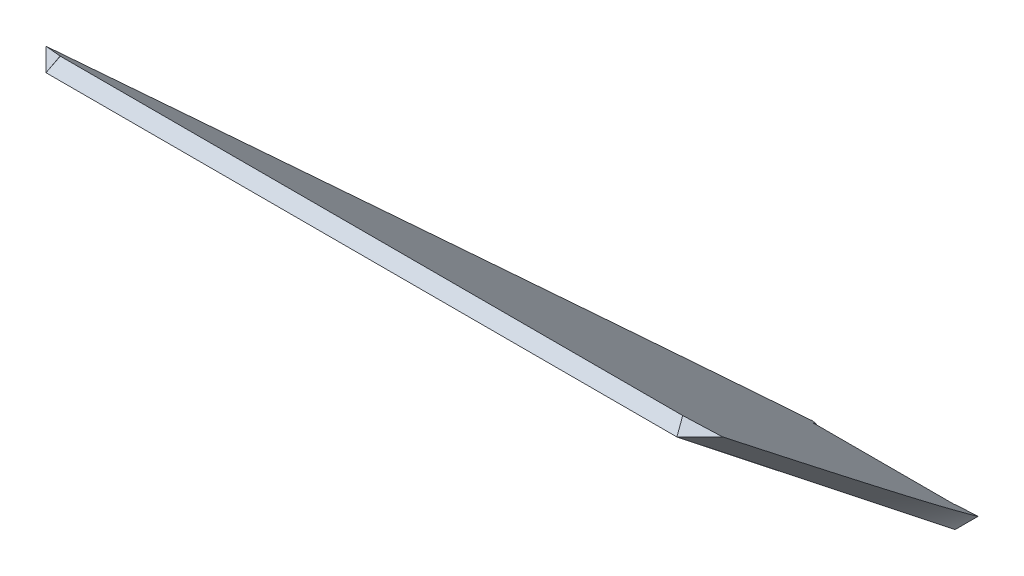
ISO-10303-21;
HEADER;
FILE_DESCRIPTION(('STEP AP214'),'2;1');
FILE_NAME('part.step','',(''),(''),'','','');
FILE_SCHEMA(('AUTOMOTIVE_DESIGN { 1 0 10303 214 1 1 1 1 }'));
ENDSEC;
DATA;
#1=APPLICATION_CONTEXT('core data for automotive mechanical design processes');
#2=APPLICATION_PROTOCOL_DEFINITION('international standard','automotive_design',2000,#1);
#3=PRODUCT_CONTEXT('',#1,'mechanical');
#4=PRODUCT('Part','Part','',(#3));
#5=PRODUCT_RELATED_PRODUCT_CATEGORY('part','',(#4));
#6=PRODUCT_DEFINITION_FORMATION('','',#4);
#7=PRODUCT_DEFINITION_CONTEXT('part definition',#1,'design');
#8=PRODUCT_DEFINITION('design','',#6,#7);
#9=PRODUCT_DEFINITION_SHAPE('','',#8);
#10=(LENGTH_UNIT() NAMED_UNIT(*) SI_UNIT(.MILLI.,.METRE.));
#11=(NAMED_UNIT(*) PLANE_ANGLE_UNIT() SI_UNIT($,.RADIAN.));
#12=(NAMED_UNIT(*) SI_UNIT($,.STERADIAN.) SOLID_ANGLE_UNIT());
#13=UNCERTAINTY_MEASURE_WITH_UNIT(LENGTH_MEASURE(1.E-05),#10,'distance_accuracy_value','');
#14=(GEOMETRIC_REPRESENTATION_CONTEXT(3) GLOBAL_UNCERTAINTY_ASSIGNED_CONTEXT((#13)) GLOBAL_UNIT_ASSIGNED_CONTEXT((#10,
#11,#12)) REPRESENTATION_CONTEXT('',''));
#15=CARTESIAN_POINT('',(0.,0.,0.));
#16=DIRECTION('',(0.,0.,1.));
#17=DIRECTION('',(1.,0.,0.));
#18=AXIS2_PLACEMENT_3D('',#15,#16,#17);
#19=CARTESIAN_POINT('',(0.,73.1918767145628,255.248422931852));
#20=DIRECTION('',(0.,0.748896955513514,-0.662686464342369));
#21=DIRECTION('',(0.,0.662686464342369,0.748896955513514));
#22=AXIS2_PLACEMENT_3D('',#19,#20,#21);
#23=PLANE('',#22);
#24=DIRECTION('',(1.,0.,0.));
#25=VECTOR('',#24,1.);
#26=CARTESIAN_POINT('',(0.,369.968304155451,590.633216401593));
#27=LINE('',#26,#25);
#28=CARTESIAN_POINT('',(-201.921191103714,369.968304155451,590.633216401593));
#29=VERTEX_POINT('',#28);
#30=CARTESIAN_POINT('',(252.607877841036,369.968304155451,590.633216401594));
#31=VERTEX_POINT('',#30);
#32=EDGE_CURVE('E65',#29,#31,#27,.T.);
#33=ORIENTED_EDGE('',*,*,#32,.T.);
#34=CARTESIAN_POINT('',(252.607877841036,369.968304155451,590.633216401593));
#35=DIRECTION('',(0.324104895830086,0.62691541117469,0.708472359186043));
#36=VECTOR('',#35,1.);
#37=LINE('',#34,#36);
#38=CARTESIAN_POINT('',(252.660470814629,370.070034632494,590.7481812434));
#39=VERTEX_POINT('',#38);
#40=EDGE_CURVE('E50',#31,#39,#37,.T.);
#41=ORIENTED_EDGE('',*,*,#40,.T.);
#42=CARTESIAN_POINT('',(272.469112036588,361.561660821633,581.132932424868));
#43=CARTESIAN_POINT('',(269.171761193808,362.983890171858,582.740183044484));
#44=CARTESIAN_POINT('',(265.872375163693,364.404046690989,584.345091173377));
#45=CARTESIAN_POINT('',(260.920223519528,366.53114751399,586.748911707113));
#46=CARTESIAN_POINT('',(259.26899147829,367.239659962003,587.54959625978));
#47=CARTESIAN_POINT('',(255.965501091814,368.655635561873,589.149779563474));
#48=CARTESIAN_POINT('',(254.313242745635,369.363098712765,589.94927831341));
#49=CARTESIAN_POINT('',(252.660470807823,370.070034635237,590.748181246499));
#50=B_SPLINE_CURVE_WITH_KNOTS('',3,(#42,#43,#44,#45,#46,#47,#48,#49),.UNSPECIFIED.,.F.,.F.,(4,2,
2,4),(0.,11.8028193722664,17.7042485304065,23.605683111687),.UNSPECIFIED.);
#51=CARTESIAN_POINT('',(272.273135875953,361.646186737307,581.228454522144));
#52=VERTEX_POINT('',#51);
#53=EDGE_CURVE('E495',#52,#39,#50,.T.);
#54=ORIENTED_EDGE('',*,*,#53,.F.);
#55=CARTESIAN_POINT('',(85.6116867373077,31.4461867373069,208.071934785526));
#56=CARTESIAN_POINT('',(86.328077039532,32.4945981077878,209.256736536771));
#57=CARTESIAN_POINT('',(87.0411990894373,33.543988036472,210.442644149232));
#58=CARTESIAN_POINT('',(88.4612652148539,35.6445995007474,212.816529259249));
#59=CARTESIAN_POINT('',(89.1682093035544,36.6958210324226,214.004506752381));
#60=CARTESIAN_POINT('',(91.2801866312815,39.8518566925311,217.571118754473));
#61=CARTESIAN_POINT('',(92.6764974425447,41.9592360514955,219.952652211032));
#62=CARTESIAN_POINT('',(95.4483032349552,46.1798713465416,224.722360199454));
#63=CARTESIAN_POINT('',(96.8237992071351,48.2931269971353,227.110534408689));
#64=CARTESIAN_POINT('',(99.5561959298672,52.5248611204987,231.892785098952));
#65=CARTESIAN_POINT('',(100.91309703351,54.6433394931923,234.286861466886));
#66=CARTESIAN_POINT('',(103.61022584829,58.8849459376454,239.08026879246));
#67=CARTESIAN_POINT('',(104.950453583716,61.008074002626,241.47959974244));
#68=CARTESIAN_POINT('',(107.615587896441,65.2579738569103,246.282379387666));
#69=CARTESIAN_POINT('',(108.940497930137,67.3847446947665,248.68582700769));
#70=CARTESIAN_POINT('',(111.576782233104,71.6420043366083,253.496923893107));
#71=CARTESIAN_POINT('',(112.888156292409,73.7724931976692,255.904573223002));
#72=CARTESIAN_POINT('',(115.498641891734,78.0368009788392,260.723635157306));
#73=CARTESIAN_POINT('',(116.797753260426,80.1706199449909,263.135047813748));
#74=CARTESIAN_POINT('',(119.384830838066,84.4412416643395,267.961245081778));
#75=CARTESIAN_POINT('',(120.672796958266,86.5780444411389,270.37602972004));
#76=CARTESIAN_POINT('',(123.238566416555,90.8543232971204,275.208620075344));
#77=CARTESIAN_POINT('',(124.516369769401,92.993799372415,277.626425787993));
#78=CARTESIAN_POINT('',(127.380426486434,97.809391140854,283.068489582006));
#79=CARTESIAN_POINT('',(128.964076708429,100.486186718872,286.093515996117));
#80=CARTESIAN_POINT('',(132.118396241491,105.843102190566,292.147325608293));
#81=CARTESIAN_POINT('',(133.689065682123,108.523222050752,295.176108768511));
#82=CARTESIAN_POINT('',(136.818744777511,113.886436465787,301.237036768861));
#83=CARTESIAN_POINT('',(138.37775447956,116.569531008518,304.269181595299));
#84=CARTESIAN_POINT('',(141.485263821458,121.938388381547,310.336486659751));
#85=CARTESIAN_POINT('',(143.033763469688,124.624151209715,313.371646895357));
#86=CARTESIAN_POINT('',(146.121360145466,129.998256827582,319.44488296156));
#87=CARTESIAN_POINT('',(147.660456529734,132.686599779548,322.482958975534));
#88=CARTESIAN_POINT('',(150.730023474365,138.065451550078,328.561558632924));
#89=CARTESIAN_POINT('',(152.260494021856,140.755960371868,331.602082279985));
#90=CARTESIAN_POINT('',(155.313586539602,146.138936630269,337.685342989888));
#91=CARTESIAN_POINT('',(156.836208499588,148.831404069438,340.728080055619));
#92=CARTESIAN_POINT('',(159.874285648632,154.218113722465,346.81555984652));
#93=CARTESIAN_POINT('',(161.389740837235,156.912355936437,349.860302571816));
#94=CARTESIAN_POINT('',(165.92606231416,164.997092244974,358.996801856741));
#95=CARTESIAN_POINT('',(168.937116220011,170.390004925963,365.091291642571));
#96=CARTESIAN_POINT('',(174.937185043098,181.181202992797,377.286342867309));
#97=CARTESIAN_POINT('',(177.926199977015,186.579488374572,383.386904301616));
#98=CARTESIAN_POINT('',(183.88538846651,197.380432377799,395.592969335275));
#99=CARTESIAN_POINT('',(186.855562605917,202.783090857831,401.69847277481));
#100=CARTESIAN_POINT('',(192.779834767188,213.592276354256,413.913851457528));
#101=CARTESIAN_POINT('',(195.733932787348,218.998803371058,420.023726701174));
#102=CARTESIAN_POINT('',(202.828309518659,232.017311316666,434.735843954797));
#103=CARTESIAN_POINT('',(206.961793916643,239.630918126005,443.339923360055));
#104=CARTESIAN_POINT('',(215.20621047308,254.863497719783,460.554146218398));
#105=CARTESIAN_POINT('',(219.317142609197,262.482470509527,469.164289677481));
#106=CARTESIAN_POINT('',(227.520229141649,277.724864882227,486.389604143167));
#107=CARTESIAN_POINT('',(231.61238351182,285.348286471364,495.004775156757));
#108=CARTESIAN_POINT('',(239.78104063111,300.599111778243,512.239617357321));
#109=CARTESIAN_POINT('',(243.857542825453,308.226515626445,520.859288691727));
#110=CARTESIAN_POINT('',(251.997133262245,323.484450459274,538.102165313733));
#111=CARTESIAN_POINT('',(256.060221528017,331.114981438438,546.72537059516));
#112=CARTESIAN_POINT('',(262.146233872229,342.562769795591,559.662429535307));
#113=CARTESIAN_POINT('',(264.173463283183,346.379022370461,563.97514767363));
#114=CARTESIAN_POINT('',(268.225252041615,354.012149718115,572.601287091429));
#115=CARTESIAN_POINT('',(270.249811389238,357.829024490866,576.914708370867));
#116=CARTESIAN_POINT('',(272.273135875953,361.646186737307,581.228454522144));
#117=B_SPLINE_CURVE_WITH_KNOTS('',3,(#55,#56,#57,#58,#59,#60,#61,#62,#63,#64,#65,#66,#67,#68,
#69,#70,#71,#72,#73,#74,#75,#76,#77,#78,#79,#80,#81,#82,#83,#84,#85,#86,#87,#88,#89,#90,#91,#92,
#93,#94,#95,#96,#97,#98,#99,#100,#101,#102,#103,#104,#105,#106,#107,#108,#109,#110,#111,#112,
#113,#114,#115,#116),.UNSPECIFIED.,.F.,.F.,(4,2,2,2,2,2,2,2,2,2,2,2,2,2,2,2,2,2,2,2,2,2,2,2,2,2,
2,2,2,2,4),(0.,5.2100997072113,10.4201882888972,20.8394007704723,31.2581156034779,
41.6766323246872,52.0951338667451,62.5112367243472,72.9275009114077,83.3439104146634,
93.7604027851277,104.176880025108,117.192832810777,130.208655522643,143.224425411204,
156.240184919578,169.256825087589,182.273484673201,195.290161283851,208.306838719768,
234.3382162043,260.369573982389,286.400121133535,312.430671045005,349.060490830894,
385.690346890382,422.320253973599,458.951447600458,495.582577503214,513.898057443142,
532.213536394331),.UNSPECIFIED.);
#118=CARTESIAN_POINT('',(85.6116867373077,31.4461867373069,208.071934785526));
#119=VERTEX_POINT('',#118);
#120=EDGE_CURVE('E438',#119,#52,#117,.T.);
#121=ORIENTED_EDGE('',*,*,#120,.F.);
#122=CARTESIAN_POINT('',(76.1545002980126,37.28183758657,214.666759622925));
#123=CARTESIAN_POINT('',(76.8725959042941,36.8816246162679,214.214481975586));
#124=CARTESIAN_POINT('',(77.5841130755615,36.4762405307049,213.756360490046));
#125=CARTESIAN_POINT('',(78.9935385195463,35.6552474613866,212.828562438942));
#126=CARTESIAN_POINT('',(79.6914472878467,35.2396388512335,212.358886295582));
#127=CARTESIAN_POINT('',(81.293833994897,34.2639798394031,211.25630143397));
#128=CARTESIAN_POINT('',(82.1931256859191,33.7001765725966,210.619151631252));
#129=CARTESIAN_POINT('',(83.5234156912824,32.8413302879826,209.648575948165));
#130=CARTESIAN_POINT('',(83.9639271566054,32.5527283072095,209.322429034978));
#131=CARTESIAN_POINT('',(84.838516734703,31.9712685269833,208.665325740138));
#132=CARTESIAN_POINT('',(85.2725947772574,31.6784106811469,208.334369306068));
#133=CARTESIAN_POINT('',(85.7034131224503,31.3834521957444,208.00103895513));
#134=B_SPLINE_CURVE_WITH_KNOTS('',3,(#122,#123,#124,#125,#126,#127,#128,#129,#130,#131,#132,
#133),.UNSPECIFIED.,.F.,.F.,(4,2,2,2,2,4),(0.,2.81478609161113,5.62946948379597,
9.34276646611986,11.2010481195248,13.0593500409829),.UNSPECIFIED.);
#135=CARTESIAN_POINT('',(76.1550441704827,37.2822442775744,214.66721922135));
#136=VERTEX_POINT('',#135);
#137=EDGE_CURVE('E433',#136,#119,#134,.T.);
#138=ORIENTED_EDGE('',*,*,#137,.F.);
#139=CARTESIAN_POINT('',(77.6806174921059,39.7683041554563,217.476696664982));
#140=CARTESIAN_POINT('',(77.1745075386594,38.9389690222923,216.539471310691));
#141=CARTESIAN_POINT('',(76.6660476196011,38.1102650665034,215.602959245173));
#142=CARTESIAN_POINT('',(76.1550441704827,37.2822442775744,214.66721922135));
#143=B_SPLINE_CURVE_WITH_KNOTS('',3,(#139,#140,#141,#142),.UNSPECIFIED.,.F.,.F.,(4,4),(0.,1.),.UNSPECIFIED.);
#144=CARTESIAN_POINT('',(77.6806174921059,39.7683041554563,217.476696664982));
#145=VERTEX_POINT('',#144);
#146=EDGE_CURVE('E11',#136,#145,#143,.F.);
#147=ORIENTED_EDGE('',*,*,#146,.T.);
#148=DIRECTION('',(1.,0.,0.));
#149=VECTOR('',#148,1.);
#150=CARTESIAN_POINT('',(0.,39.7683041554508,217.476696664976));
#151=LINE('',#150,#149);
#152=CARTESIAN_POINT('',(-26.9939307547616,39.7683041554508,217.476696664976));
#153=VERTEX_POINT('',#152);
#154=EDGE_CURVE('E57',#153,#145,#151,.T.);
#155=ORIENTED_EDGE('',*,*,#154,.F.);
#156=CARTESIAN_POINT('',(-25.4683574331419,37.2822442775747,214.66721922135));
#157=CARTESIAN_POINT('',(-25.979334962238,38.1102230661662,215.60291178091));
#158=CARTESIAN_POINT('',(-26.4877957951712,38.9389280460651,216.539425003767));
#159=CARTESIAN_POINT('',(-26.9939307547615,39.7683041554507,217.476696664976));
#160=B_SPLINE_CURVE_WITH_KNOTS('',3,(#156,#157,#158,#159),.UNSPECIFIED.,.F.,.F.,(4,4),(0.,1.),.UNSPECIFIED.);
#161=CARTESIAN_POINT('',(-25.4683574331419,37.2822442775747,214.66721922135));
#162=VERTEX_POINT('',#161);
#163=EDGE_CURVE('E139',#162,#153,#160,.T.);
#164=ORIENTED_EDGE('',*,*,#163,.F.);
#165=CARTESIAN_POINT('',(-35.0167263851095,31.3834521957443,208.001038955131));
#166=CARTESIAN_POINT('',(-34.3641506648268,31.8302448765221,208.505955980578));
#167=CARTESIAN_POINT('',(-33.7040793396894,32.27221432409,209.005422306697));
#168=CARTESIAN_POINT('',(-32.3693140371701,33.1463046929449,209.993225213957));
#169=CARTESIAN_POINT('',(-31.694620767057,33.5784260885207,210.481562331088));
#170=CARTESIAN_POINT('',(-30.1132333147832,34.5690203797246,211.601025438831));
#171=CARTESIAN_POINT('',(-29.2012387055355,35.1237883744351,212.227964548968));
#172=CARTESIAN_POINT('',(-27.814964258512,35.9428217070811,213.153547916498));
#173=CARTESIAN_POINT('',(-27.3496198722928,36.213761044593,213.459734410277));
#174=CARTESIAN_POINT('',(-26.4130770677261,36.7511623698545,214.06704757877));
#175=CARTESIAN_POINT('',(-25.9418786237884,37.0176243380199,214.368174231353));
#176=CARTESIAN_POINT('',(-25.4678135606718,37.2818375865704,214.666759622926));
#177=B_SPLINE_CURVE_WITH_KNOTS('',3,(#165,#166,#167,#168,#169,#170,#171,#172,#173,#174,#175,
#176),.UNSPECIFIED.,.F.,.F.,(4,2,2,2,2,4),(0.,2.81482991455123,5.62952397734507,
9.34281968900762,11.2010802864408,13.0593490098748),.UNSPECIFIED.);
#178=CARTESIAN_POINT('',(-34.9249999999667,31.4461867373069,208.071934785526));
#179=VERTEX_POINT('',#178);
#180=EDGE_CURVE('E129',#179,#162,#177,.T.);
#181=ORIENTED_EDGE('',*,*,#180,.F.);
#182=CARTESIAN_POINT('',(-221.586449138631,361.646186737307,581.228454522144));
#183=CARTESIAN_POINT('',(-219.728267523708,358.140578555084,577.266793259763));
#184=CARTESIAN_POINT('',(-217.869043692254,354.635213001676,573.305406190367));
#185=CARTESIAN_POINT('',(-214.148357838659,347.625003417495,565.383221420357));
#186=CARTESIAN_POINT('',(-212.286895816424,344.120159386745,561.422423719768));
#187=CARTESIAN_POINT('',(-206.698920874521,333.606462184674,549.540974121072));
#188=CARTESIAN_POINT('',(-202.968820265333,326.59844614083,541.621268254388));
#189=CARTESIAN_POINT('',(-195.497706056269,312.585202004656,525.785007163915));
#190=CARTESIAN_POINT('',(-191.756692782415,305.579973836001,517.868451853872));
#191=CARTESIAN_POINT('',(-184.261875251293,291.572522163426,502.038736782651));
#192=CARTESIAN_POINT('',(-180.508070994042,284.570298659502,494.12557702147));
#193=CARTESIAN_POINT('',(-174.23924321095,272.902850291907,480.940281966781));
#194=CARTESIAN_POINT('',(-171.728378545483,268.236644091082,475.667037671586));
#195=CARTESIAN_POINT('',(-166.699219812176,258.90599027841,465.122536449285));
#196=CARTESIAN_POINT('',(-164.180925744797,254.241542666454,459.851279522055));
#197=CARTESIAN_POINT('',(-159.136021045818,244.914623706156,449.310999028141));
#198=CARTESIAN_POINT('',(-156.609410415852,240.252152357426,444.041975461019));
#199=CARTESIAN_POINT('',(-151.546749392768,230.929281257968,433.506269423989));
#200=CARTESIAN_POINT('',(-149.010698681344,226.268881583134,428.239587039851));
#201=CARTESIAN_POINT('',(-143.92802777493,216.950612194785,417.709081361703));
#202=CARTESIAN_POINT('',(-141.381407577132,212.292742481942,412.445258068453));
#203=CARTESIAN_POINT('',(-136.276165426757,202.979884776579,401.92086809227));
#204=CARTESIAN_POINT('',(-133.717543459017,198.324896787709,396.660301413461));
#205=CARTESIAN_POINT('',(-129.271961182806,190.261375984462,387.547777610423));
#206=CARTESIAN_POINT('',(-127.388173088475,186.852075117069,383.694952515294));
#207=CARTESIAN_POINT('',(-123.612450799164,180.035455175085,375.991541934077));
#208=CARTESIAN_POINT('',(-121.720516605645,176.628136100138,372.140956447586));
#209=CARTESIAN_POINT('',(-117.927612546117,169.815714133103,364.442289966071));
#210=CARTESIAN_POINT('',(-116.026642697215,166.410611236832,360.594208966321));
#211=CARTESIAN_POINT('',(-112.214640327493,159.602889436103,352.900854107159));
#212=CARTESIAN_POINT('',(-110.303607832889,156.200270525198,349.055580240463));
#213=CARTESIAN_POINT('',(-106.470441638288,149.398090536141,341.368488140709));
#214=CARTESIAN_POINT('',(-104.5483088423,145.998529234327,337.526669654894));
#215=CARTESIAN_POINT('',(-100.691409524141,139.202550370206,329.846585399476));
#216=CARTESIAN_POINT('',(-98.7566429888977,135.806132811156,326.008319633554));
#217=CARTESIAN_POINT('',(-94.8728567346785,129.016853104829,318.335806045634));
#218=CARTESIAN_POINT('',(-92.9238369272115,125.623990979776,314.501558248749));
#219=CARTESIAN_POINT('',(-89.0096414393506,118.842303982096,306.837625123379));
#220=CARTESIAN_POINT('',(-87.0444655283365,115.453479167895,303.007939860919));
#221=CARTESIAN_POINT('',(-83.489366677386,109.355675475913,296.116858080976));
#222=CARTESIAN_POINT('',(-81.9027400934423,106.645852694765,293.054507874688));
#223=CARTESIAN_POINT('',(-78.7163693203528,101.229589559051,286.933629916782));
#224=CARTESIAN_POINT('',(-77.116625109455,98.5231492101035,283.875102171512));
#225=CARTESIAN_POINT('',(-73.9025000229165,93.1141222809259,277.76240179582));
#226=CARTESIAN_POINT('',(-72.2881193151617,90.4115356569031,274.708229115908));
#227=CARTESIAN_POINT('',(-69.0429501045876,85.0107531707261,268.604845722824));
#228=CARTESIAN_POINT('',(-67.412161933953,82.3125572209584,265.555634910641));
#229=CARTESIAN_POINT('',(-64.1321058888313,76.9211719832931,259.462871276945));
#230=CARTESIAN_POINT('',(-62.4828384391664,74.2279825819522,256.419318327229));
#231=CARTESIAN_POINT('',(-59.1628969028347,68.8465264804535,250.337775535132));
#232=CARTESIAN_POINT('',(-57.4922169921302,66.1582613570895,247.299787474672));
#233=CARTESIAN_POINT('',(-54.1270406374421,60.7882778250525,241.231209746453));
#234=CARTESIAN_POINT('',(-52.4325441630797,58.106559424735,238.200620088137));
#235=CARTESIAN_POINT('',(-49.0163207169957,52.750656038211,232.147954225748));
#236=CARTESIAN_POINT('',(-47.2945930284394,50.0764712525097,229.125878248264));
#237=CARTESIAN_POINT('',(-44.6885343001923,46.071790930748,224.600219339947));
#238=CARTESIAN_POINT('',(-43.8159047401147,44.7379486440241,223.09285427153));
#239=CARTESIAN_POINT('',(-42.062259189889,42.0726878671061,220.080863248801));
#240=CARTESIAN_POINT('',(-41.1812432091195,40.7412693742034,218.576237291428));
#241=CARTESIAN_POINT('',(-39.4100809387944,38.0808785520003,215.569749767646));
#242=CARTESIAN_POINT('',(-38.5199333896024,36.7519065908336,214.067888617263));
#243=CARTESIAN_POINT('',(-36.7299255078319,34.0968324490152,211.067409433727));
#244=CARTESIAN_POINT('',(-35.8300651365628,32.7707302798205,209.568791413522));
#245=CARTESIAN_POINT('',(-34.9249999999667,31.4461867373068,208.071934785526));
#246=B_SPLINE_CURVE_WITH_KNOTS('',3,(#182,#183,#184,#185,#186,#187,#188,#189,#190,#191,#192,
#193,#194,#195,#196,#197,#198,#199,#200,#201,#202,#203,#204,#205,#206,#207,#208,#209,#210,#211,
#212,#213,#214,#215,#216,#217,#218,#219,#220,#221,#222,#223,#224,#225,#226,#227,#228,#229,#230,
#231,#232,#233,#234,#235,#236,#237,#238,#239,#240,#241,#242,#243,#244,#245),.UNSPECIFIED.,.F.,
.F.,(4,2,2,2,2,2,2,2,2,2,2,2,2,2,2,2,2,2,2,2,2,2,2,2,2,2,2,2,2,2,2,4),(0.,16.8205820677753,
33.6411648477443,67.282341142444,100.922522479067,134.562703774392,156.989586897003,
179.416468629735,201.843345956793,224.270986462769,246.698632929556,269.126307739983,
285.562428522787,301.998546357781,318.434633087568,334.870677017563,351.305400758193,
367.740141507784,384.174984378801,400.610062257639,413.768561221389,426.927082009212,
440.085452054531,453.243556230184,466.401358530929,479.562818992678,492.724296243828,
505.886120536367,512.467510741843,519.048893588279,525.631196836412,532.213526314568),.UNSPECIFIED.);
#247=CARTESIAN_POINT('',(-221.586449138631,361.646186737307,581.228454522144));
#248=VERTEX_POINT('',#247);
#249=EDGE_CURVE('E116',#248,#179,#246,.T.);
#250=ORIENTED_EDGE('',*,*,#249,.F.);
#251=CARTESIAN_POINT('',(-201.973784070501,370.070034635237,590.748181246499));
#252=CARTESIAN_POINT('',(-203.626548367624,369.363101979303,589.949282004899));
#253=CARTESIAN_POINT('',(-205.278799183565,368.65564205652,589.149786903025));
#254=CARTESIAN_POINT('',(-209.408150248002,366.885677685553,587.149563569506));
#255=CARTESIAN_POINT('',(-211.88461004945,365.822517002871,585.948093732225));
#256=CARTESIAN_POINT('',(-216.835236735855,363.693846428147,583.542499233951));
#257=CARTESIAN_POINT('',(-219.309403616098,362.62833653129,582.33837456752));
#258=CARTESIAN_POINT('',(-221.782425299266,361.561660821633,581.132932424868));
#259=B_SPLINE_CURVE_WITH_KNOTS('',3,(#251,#252,#253,#254,#255,#256,#257,#258),.UNSPECIFIED.,.F.,
.F.,(4,2,2,4),(0.,5.90140759302028,14.75353652358,23.6056836100636),.UNSPECIFIED.);
#260=CARTESIAN_POINT('',(-201.973784077307,370.070034632494,590.7481812434));
#261=VERTEX_POINT('',#260);
#262=EDGE_CURVE('E463',#261,#248,#259,.T.);
#263=ORIENTED_EDGE('',*,*,#262,.F.);
#264=CARTESIAN_POINT('',(-201.921191103714,369.968304155451,590.633216401593));
#265=DIRECTION('',(-0.324104895833496,0.626915411175067,0.70847235918415));
#266=VECTOR('',#265,1.);
#267=LINE('',#264,#266);
#268=EDGE_CURVE('E162',#29,#261,#267,.T.);
#269=ORIENTED_EDGE('',*,*,#268,.F.);
#270=EDGE_LOOP('',(#33,#41,#54,#121,#138,#147,#155,#164,#181,#250,#263,#269));
#271=FACE_BOUND('',#270,.T.);
#272=ADVANCED_FACE('F39',(#271),#23,.T.);
#273=CARTESIAN_POINT('',(0.,64.8697592964189,262.612526266856));
#274=DIRECTION('',(0.,0.748896955513514,-0.662686464342369));
#275=DIRECTION('',(0.,0.662686464342369,0.748896955513514));
#276=AXIS2_PLACEMENT_3D('',#273,#274,#275);
#277=PLANE('',#276);
#278=DIRECTION('',(0.323023809091136,0.627160398498757,0.708749217505835));
#279=VECTOR('',#278,1.);
#280=CARTESIAN_POINT('',(85.6116867373077,31.4461867373069,224.84079999998));
#281=LINE('',#280,#279);
#282=CARTESIAN_POINT('',(85.6116867373077,31.4461867373069,224.84079999998));
#283=VERTEX_POINT('',#282);
#284=CARTESIAN_POINT('',(255.683748074746,361.646186737307,597.997319736598));
#285=VERTEX_POINT('',#284);
#286=EDGE_CURVE('E121',#283,#285,#281,.T.);
#287=ORIENTED_EDGE('',*,*,#286,.T.);
#288=DIRECTION('',(1.,0.,0.));
#289=VECTOR('',#288,1.);
#290=CARTESIAN_POINT('',(-204.997061337424,361.646186737307,597.997319736598));
#291=LINE('',#290,#289);
#292=CARTESIAN_POINT('',(-204.997061337424,361.646186737307,597.997319736598));
#293=VERTEX_POINT('',#292);
#294=EDGE_CURVE('E154',#293,#285,#291,.T.);
#295=ORIENTED_EDGE('',*,*,#294,.F.);
#296=DIRECTION('',(-0.323023809091168,0.62716039849875,0.708749217505826));
#297=VECTOR('',#296,1.);
#298=CARTESIAN_POINT('',(-119.961030668695,196.546186737307,411.419059868289));
#299=LINE('',#298,#297);
#300=CARTESIAN_POINT('',(-34.9249999999667,31.4461867373069,224.84079999998));
#301=VERTEX_POINT('',#300);
#302=EDGE_CURVE('E115',#301,#293,#299,.T.);
#303=ORIENTED_EDGE('',*,*,#302,.F.);
#304=DIRECTION('',(1.,0.,0.));
#305=VECTOR('',#304,1.);
#306=CARTESIAN_POINT('',(-34.9249999999667,31.4461867373069,224.84079999998));
#307=LINE('',#306,#305);
#308=EDGE_CURVE('E146',#301,#283,#307,.T.);
#309=ORIENTED_EDGE('',*,*,#308,.T.);
#310=EDGE_LOOP('',(#287,#295,#303,#309));
#311=FACE_BOUND('',#310,.T.);
#312=ADVANCED_FACE('F157',(#311),#277,.F.);
#313=CARTESIAN_POINT('',(-201.921191103714,369.968304155451,590.633216401593));
#314=DIRECTION('',(-0.915166256682117,-0.0180699960875279,-0.402671327352517));
#315=DIRECTION('',(0.0165397512172865,-0.99983672429122,0.0072774575418579));
#316=AXIS2_PLACEMENT_3D('',#313,#314,#315);
#317=PLANE('',#316);
#318=CARTESIAN_POINT('',(-201.921191103714,369.968304155451,590.633216401593));
#319=DIRECTION('',(-0.266763292887405,-0.721758487054809,0.63867208482305));
#320=VECTOR('',#319,1.);
#321=LINE('',#318,#320);
#322=EDGE_CURVE('E273',#29,#293,#321,.T.);
#323=ORIENTED_EDGE('',*,*,#322,.F.);
#324=ORIENTED_EDGE('',*,*,#268,.T.);
#325=CARTESIAN_POINT('',(-204.997061327172,361.646186739858,597.997319743836));
#326=CARTESIAN_POINT('',(-204.87094611933,361.997004424452,597.695128539124));
#327=CARTESIAN_POINT('',(-204.744849084526,362.347844128601,597.392955312945));
#328=CARTESIAN_POINT('',(-204.492691355183,363.049567559264,596.7886448119));
#329=CARTESIAN_POINT('',(-204.366630660643,363.400451285779,596.486507537035));
#330=CARTESIAN_POINT('',(-204.11454560602,364.102262744428,595.882268932872));
#331=CARTESIAN_POINT('',(-203.988521245936,364.453190476562,595.580167603574));
#332=CARTESIAN_POINT('',(-203.736508854411,365.155089929712,594.976000884796));
#333=CARTESIAN_POINT('',(-203.610520822972,365.506061650728,594.673935495316));
#334=CARTESIAN_POINT('',(-203.358581082926,366.208049064907,594.069840650427));
#335=CARTESIAN_POINT('',(-203.23262937432,366.559064758072,593.767811195019));
#336=CARTESIAN_POINT('',(-202.980762274132,367.261140099821,593.163788212522));
#337=CARTESIAN_POINT('',(-202.85484688255,367.612199748406,592.861794685435));
#338=CARTESIAN_POINT('',(-202.603052410597,368.314362984277,592.257843553833));
#339=CARTESIAN_POINT('',(-202.477173330228,368.665466571563,591.95588594932));
#340=CARTESIAN_POINT('',(-202.225451474889,369.36771766812,591.352006657116));
#341=CARTESIAN_POINT('',(-202.099608699921,369.718865177392,591.050084969426));
#342=CARTESIAN_POINT('',(-201.97378407724,370.070034632344,590.748181243254));
#343=B_SPLINE_CURVE_WITH_KNOTS('',3,(#325,#326,#327,#328,#329,#330,#331,#332,#333,#334,#335,
#336,#337,#338,#339,#340,#341,#342),.UNSPECIFIED.,.F.,.F.,(4,2,2,2,2,2,2,2,4),(0.,
1.4396800185012,2.87936004415944,4.31904008412378,5.75872014553524,7.19840023552639,
8.63808036122151,10.0777605297367,11.5174407481804),.UNSPECIFIED.);
#344=EDGE_CURVE('E132',#261,#293,#343,.F.);
#345=ORIENTED_EDGE('',*,*,#344,.T.);
#346=EDGE_LOOP('',(#323,#324,#345));
#347=FACE_BOUND('',#346,.T.);
#348=ADVANCED_FACE('F231',(#347),#317,.F.);
#349=CARTESIAN_POINT('',(252.607877841036,369.968304155451,590.633216401593));
#350=DIRECTION('',(-0.915166256682497,0.0180699960866787,0.402671327351691));
#351=DIRECTION('',(-0.0165397512165158,-0.999836724291235,0.00727745754150086));
#352=AXIS2_PLACEMENT_3D('',#349,#350,#351);
#353=PLANE('',#352);
#354=CARTESIAN_POINT('',(252.660470814562,370.070034632344,590.748181243254));
#355=CARTESIAN_POINT('',(252.786295437243,369.718865177392,591.050084969426));
#356=CARTESIAN_POINT('',(252.912138212211,369.36771766812,591.352006657116));
#357=CARTESIAN_POINT('',(253.16386006755,368.665466571563,591.95588594932));
#358=CARTESIAN_POINT('',(253.289739147919,368.314362984277,592.257843553833));
#359=CARTESIAN_POINT('',(253.541533619872,367.612199748406,592.861794685435));
#360=CARTESIAN_POINT('',(253.667449011454,367.261140099821,593.163788212521));
#361=CARTESIAN_POINT('',(253.919316111642,366.559064758072,593.767811195018));
#362=CARTESIAN_POINT('',(254.045267820248,366.208049064908,594.069840650427));
#363=CARTESIAN_POINT('',(254.297207560294,365.506061650728,594.673935495316));
#364=CARTESIAN_POINT('',(254.423195591733,365.155089929712,594.976000884796));
#365=CARTESIAN_POINT('',(254.675207983258,364.453190476563,595.580167603574));
#366=CARTESIAN_POINT('',(254.801232343342,364.102262744428,595.882268932872));
#367=CARTESIAN_POINT('',(255.053317397966,363.400451285779,596.486507537035));
#368=CARTESIAN_POINT('',(255.179378092505,363.049567559265,596.7886448119));
#369=CARTESIAN_POINT('',(255.431535821848,362.347844128601,597.392955312945));
#370=CARTESIAN_POINT('',(255.557632856652,361.997004424452,597.695128539124));
#371=CARTESIAN_POINT('',(255.683748064494,361.646186739859,597.997319743836));
#372=B_SPLINE_CURVE_WITH_KNOTS('',3,(#354,#355,#356,#357,#358,#359,#360,#361,#362,#363,#364,
#365,#366,#367,#368,#369,#370,#371),.UNSPECIFIED.,.F.,.F.,(4,2,2,2,2,2,2,2,4),(0.,
1.43968021844362,2.87936038695885,4.31904051265375,5.75872060264493,7.1984006640563,
8.63808070402076,10.0777607296788,11.5174407481797),.UNSPECIFIED.);
#373=EDGE_CURVE('E316',#39,#285,#372,.T.);
#374=ORIENTED_EDGE('',*,*,#373,.F.);
#375=ORIENTED_EDGE('',*,*,#40,.F.);
#376=CARTESIAN_POINT('',(252.607877841036,369.968304155451,590.633216401593));
#377=DIRECTION('',(0.266763291907711,-0.721758487035483,0.638672085254094));
#378=VECTOR('',#377,1.);
#379=LINE('',#376,#378);
#380=EDGE_CURVE('E465',#31,#285,#379,.T.);
#381=ORIENTED_EDGE('',*,*,#380,.T.);
#382=EDGE_LOOP('',(#374,#375,#381));
#383=FACE_BOUND('',#382,.T.);
#384=ADVANCED_FACE('F240',(#383),#353,.T.);
#385=CARTESIAN_POINT('',(-204.997061337424,361.646186737307,597.997319736598));
#386=DIRECTION('',(0.,0.662686464342369,0.748896955513514));
#387=DIRECTION('',(1.,0.,0.));
#388=AXIS2_PLACEMENT_3D('',#385,#386,#387);
#389=PLANE('',#388);
#390=ORIENTED_EDGE('',*,*,#380,.F.);
#391=ORIENTED_EDGE('',*,*,#32,.F.);
#392=ORIENTED_EDGE('',*,*,#322,.T.);
#393=ORIENTED_EDGE('',*,*,#294,.T.);
#394=EDGE_LOOP('',(#390,#391,#392,#393));
#395=FACE_BOUND('',#394,.T.);
#396=ADVANCED_FACE('F246',(#395),#389,.T.);
#397=CARTESIAN_POINT('',(77.6806174921059,39.7683041554563,217.476696664982));
#398=CARTESIAN_POINT('',(77.1745075386594,38.9389690222923,216.539471310691));
#399=CARTESIAN_POINT('',(76.6660476196011,38.1102650665034,215.602959245173));
#400=CARTESIAN_POINT('',(76.1550441704827,37.2822442775744,214.66721922135));
#401=CARTESIAN_POINT('',(76.1499341359915,37.2739640696851,214.657861821112));
#402=CARTESIAN_POINT('',(76.1448241015003,37.2656838617958,214.648504420873));
#403=CARTESIAN_POINT('',(76.1397140670091,37.2574036539065,214.639147020635));
#404=B_SPLINE_CURVE_WITH_KNOTS('',3,(#397,#398,#399,#400,#401,#402,#403),.UNSPECIFIED.,.F.,.F.,
(4,3,4),(0.,1.,1.01),.UNSPECIFIED.);
#405=DIRECTION('',(-0.610722370638425,0.497359138585639,-0.61615912982535));
#406=VECTOR('',#405,1.);
#407=SURFACE_OF_LINEAR_EXTRUSION('',#404,#406);
#408=CARTESIAN_POINT('',(85.611686910675,31.4461868299457,224.840799918006));
#409=CARTESIAN_POINT('',(85.2812979185139,31.7929248310527,224.533936390303));
#410=CARTESIAN_POINT('',(84.9509025929877,32.1396620153063,224.227078758517));
#411=CARTESIAN_POINT('',(84.2900929214782,32.8331414926162,223.613369268101));
#412=CARTESIAN_POINT('',(83.9596785752501,33.1798837856409,223.306517409699));
#413=CARTESIAN_POINT('',(83.2988309568517,33.8733734551062,222.692819437364));
#414=CARTESIAN_POINT('',(82.9683976844392,34.2201208315156,222.385973323657));
#415=CARTESIAN_POINT('',(82.3075123081824,34.913620642365,221.772286812026));
#416=CARTESIAN_POINT('',(81.9770602040982,35.260373076774,221.465446414326));
#417=CARTESIAN_POINT('',(81.3161372590101,35.9538829782365,220.851771306023));
#418=CARTESIAN_POINT('',(80.9856664177685,36.3006404452594,220.544936595642));
#419=CARTESIAN_POINT('',(80.3247060928767,36.9941603865642,219.931272833292));
#420=CARTESIAN_POINT('',(79.9942166089913,37.3409228608157,219.624443781542));
#421=CARTESIAN_POINT('',(79.3332190933243,38.0344527911916,219.010791307768));
#422=CARTESIAN_POINT('',(79.0027110613098,38.3812202472859,218.70396788596));
#423=CARTESIAN_POINT('',(78.3416765438927,39.0747601159624,218.090326643388));
#424=CARTESIAN_POINT('',(78.0111500582597,39.4215325285148,217.783508822837));
#425=CARTESIAN_POINT('',(77.6806174921062,39.7683041554561,217.476696664982));
#426=B_SPLINE_CURVE_WITH_KNOTS('',3,(#408,#409,#410,#411,#412,#413,#414,#415,#416,#417,#418,
#419,#420,#421,#422,#423,#424,#425),.UNSPECIFIED.,.F.,.F.,(4,2,2,2,2,2,2,2,4),(0.,
1.70644196193139,3.41291706805945,5.11942515525661,6.82596606037191,8.53253962023097,
10.2391456716361,11.9457840513665,13.6524545961785),.UNSPECIFIED.);
#427=EDGE_CURVE('E142',#145,#283,#426,.F.);
#428=ORIENTED_EDGE('',*,*,#427,.F.);
#429=ORIENTED_EDGE('',*,*,#146,.F.);
#430=CARTESIAN_POINT('',(76.1549375324073,37.2815591312126,214.666850913674));
#431=CARTESIAN_POINT('',(76.5538651683006,36.9959773852757,215.082601461972));
#432=CARTESIAN_POINT('',(76.9534710541505,36.7147460036554,215.50069529187));
#433=CARTESIAN_POINT('',(77.7511147560999,36.1632149933288,216.338575672333));
#434=CARTESIAN_POINT('',(78.149143515294,35.8928518483321,216.758329042917));
#435=CARTESIAN_POINT('',(78.9436285980142,35.3630573580264,217.599530156644));
#436=CARTESIAN_POINT('',(79.3400767689022,35.1035633594128,218.020946124348));
#437=CARTESIAN_POINT('',(80.1313934317828,34.5955079767482,218.865472379842));
#438=CARTESIAN_POINT('',(80.5262546880562,34.3468849469482,219.288552353086));
#439=CARTESIAN_POINT('',(81.3143900069179,33.8605722248268,220.136407332301));
#440=CARTESIAN_POINT('',(81.7076577399911,33.6228220497712,220.561153519763));
#441=CARTESIAN_POINT('',(82.4925974007173,33.1582558194605,221.41234154915));
#442=CARTESIAN_POINT('',(82.8842638942527,32.9313806032649,221.838756104859));
#443=CARTESIAN_POINT('',(83.6659922367689,32.4885653148399,222.693282361307));
#444=CARTESIAN_POINT('',(84.0560495248963,32.272567564875,223.121368333283));
#445=CARTESIAN_POINT('',(84.8345479242506,31.8515075418871,223.979236804279));
#446=CARTESIAN_POINT('',(85.2229853342446,31.6463892442899,224.408995169192));
#447=CARTESIAN_POINT('',(85.6116868868969,31.4461866602598,224.840799829601));
#448=B_SPLINE_CURVE_WITH_KNOTS('',3,(#430,#431,#432,#433,#434,#435,#436,#437,#438,#439,#440,
#441,#442,#443,#444,#445,#446,#447),.UNSPECIFIED.,.F.,.F.,(4,2,2,2,2,2,2,2,4),(0.,
1.92921869592902,3.84471831925197,5.74697547816959,7.63647579579475,9.51371389367912,
11.3791933536351,13.2334266561491,15.0769350939219),.UNSPECIFIED.);
#449=EDGE_CURVE('E417',#136,#283,#448,.T.);
#450=ORIENTED_EDGE('',*,*,#449,.T.);
#451=EDGE_LOOP('',(#428,#429,#450));
#452=FACE_BOUND('',#451,.T.);
#453=ADVANCED_FACE('F183',(#452),#407,.F.);
#454=CARTESIAN_POINT('',(-26.9939307547615,39.7683041554507,217.476696664976));
#455=CARTESIAN_POINT('',(-26.4877957951712,38.9389280460651,216.539425003767));
#456=CARTESIAN_POINT('',(-25.979334962238,38.1102230661662,215.60291178091));
#457=CARTESIAN_POINT('',(-25.4683574331419,37.2822442775747,214.66721922135));
#458=CARTESIAN_POINT('',(-25.4632476578509,37.2739644896888,214.657862295755));
#459=CARTESIAN_POINT('',(-25.45813788256,37.2656847018029,214.648505370159));
#460=CARTESIAN_POINT('',(-25.453028107269,37.2574049139169,214.639148444563));
#461=B_SPLINE_CURVE_WITH_KNOTS('',3,(#454,#455,#456,#457,#458,#459,#460),.UNSPECIFIED.,.F.,.F.,
(4,3,4),(0.,1.,1.01),.UNSPECIFIED.);
#462=DIRECTION('',(0.610722946119665,0.497356328708973,-0.616160827524802));
#463=VECTOR('',#462,1.);
#464=SURFACE_OF_LINEAR_EXTRUSION('',#461,#463);
#465=CARTESIAN_POINT('',(-25.4682507950668,37.2815591312125,214.666850913678));
#466=CARTESIAN_POINT('',(-25.8611208786605,37.0003137577915,215.076289316274));
#467=CARTESIAN_POINT('',(-26.2546438000819,36.7232918721442,215.488007749852));
#468=CARTESIAN_POINT('',(-27.0419259394941,36.1786336894179,216.314941664555));
#469=CARTESIAN_POINT('',(-27.4356820228337,35.9109753558701,216.730145617925));
#470=CARTESIAN_POINT('',(-28.2233969812067,35.3851929845644,217.564050742215));
#471=CARTESIAN_POINT('',(-28.6173530339144,35.127047341654,217.982740951561));
#472=CARTESIAN_POINT('',(-29.405426342985,34.6204422105519,218.823617636135));
#473=CARTESIAN_POINT('',(-29.7995411029426,34.3719616314616,219.245793741045));
#474=CARTESIAN_POINT('',(-30.5878850672491,33.8848405064639,220.09364153072));
#475=CARTESIAN_POINT('',(-30.9821121041132,33.6461794764104,220.519303458168));
#476=CARTESIAN_POINT('',(-31.7706275059804,33.178853623414,221.374121975472));
#477=CARTESIAN_POINT('',(-32.1649140342772,32.9501690220743,221.803269443833));
#478=CARTESIAN_POINT('',(-32.9534899810068,32.5029543392621,222.665058493827));
#479=CARTESIAN_POINT('',(-33.3477778888608,32.2844052920026,223.097691611104));
#480=CARTESIAN_POINT('',(-34.136289101278,31.8576223180129,223.966449876882));
#481=CARTESIAN_POINT('',(-34.5305112189474,31.6493703525762,224.402567242629));
#482=CARTESIAN_POINT('',(-34.9250001475427,31.4461866612967,224.840799831894));
#483=B_SPLINE_CURVE_WITH_KNOTS('',3,(#465,#466,#467,#468,#469,#470,#471,#472,#473,#474,#475,
#476,#477,#478,#479,#480,#481,#482),.UNSPECIFIED.,.F.,.F.,(4,2,2,2,2,2,2,2,4),(0.,
1.8999262577476,3.79503043928664,5.68552553323621,7.57163279369942,9.45358226788971,
11.3316133511675,13.2059753701768,15.0769281946491),.UNSPECIFIED.);
#484=EDGE_CURVE('E125',#162,#301,#483,.T.);
#485=ORIENTED_EDGE('',*,*,#484,.F.);
#486=ORIENTED_EDGE('',*,*,#163,.T.);
#487=CARTESIAN_POINT('',(-26.9939307547615,39.7683041554508,217.476696664976));
#488=CARTESIAN_POINT('',(-27.3244625854947,39.4215312305682,217.783507423431));
#489=CARTESIAN_POINT('',(-27.6549883980516,39.0747577094388,218.090323991454));
#490=CARTESIAN_POINT('',(-28.3160217588806,38.3812159372417,218.703963083402));
#491=CARTESIAN_POINT('',(-28.6465293073785,38.0344476861963,219.010785607109));
#492=CARTESIAN_POINT('',(-29.3075260469154,37.3409164810519,219.624436640806));
#493=CARTESIAN_POINT('',(-29.6380152381825,36.9941535269755,219.931265150577));
#494=CARTESIAN_POINT('',(-30.2989751700794,36.3006329426547,220.54492818679));
#495=CARTESIAN_POINT('',(-30.6294459109396,35.9538753124331,220.851762713009));
#496=CARTESIAN_POINT('',(-31.2903688488455,35.2603654027072,221.465437812503));
#497=CARTESIAN_POINT('',(-31.6208210461239,34.913613123226,221.772278385553));
#498=CARTESIAN_POINT('',(-32.2817068036884,34.2201139418664,222.385965609096));
#499=CARTESIAN_POINT('',(-32.6121403642095,33.8733670400113,222.692812259361));
#500=CARTESIAN_POINT('',(-33.2729887550829,33.1798786407891,223.306511667718));
#501=CARTESIAN_POINT('',(-33.6034035856725,32.8331371434455,223.61336442558));
#502=CARTESIAN_POINT('',(-34.2642144235019,32.1396595801326,224.22707607952));
#503=CARTESIAN_POINT('',(-34.5946104309814,31.7929235141869,224.533934975365));
#504=CARTESIAN_POINT('',(-34.9250001710007,31.4461868286991,224.840799919109));
#505=B_SPLINE_CURVE_WITH_KNOTS('',3,(#487,#488,#489,#490,#491,#492,#493,#494,#495,#496,#497,
#498,#499,#500,#501,#502,#503,#504),.UNSPECIFIED.,.F.,.F.,(4,2,2,2,2,2,2,2,4),(0.,
1.70666937230739,3.41330690985082,5.11991245173363,6.82648583708243,8.53302690504696,
10.2395354948003,11.9460114455392,13.6524545964839),.UNSPECIFIED.);
#506=EDGE_CURVE('E133',#153,#301,#505,.T.);
#507=ORIENTED_EDGE('',*,*,#506,.T.);
#508=EDGE_LOOP('',(#485,#486,#507));
#509=FACE_BOUND('',#508,.T.);
#510=ADVANCED_FACE('F138',(#509),#464,.T.);
#511=CARTESIAN_POINT('',(-34.9249999999667,31.4461867373069,224.84079999998));
#512=DIRECTION('',(0.,0.662686464342369,0.748896955513514));
#513=DIRECTION('',(1.,0.,0.));
#514=AXIS2_PLACEMENT_3D('',#511,#512,#513);
#515=PLANE('',#514);
#516=ORIENTED_EDGE('',*,*,#506,.F.);
#517=ORIENTED_EDGE('',*,*,#154,.T.);
#518=ORIENTED_EDGE('',*,*,#427,.T.);
#519=ORIENTED_EDGE('',*,*,#308,.F.);
#520=EDGE_LOOP('',(#516,#517,#518,#519));
#521=FACE_BOUND('',#520,.T.);
#522=ADVANCED_FACE('F147',(#521),#515,.F.);
#523=CARTESIAN_POINT('',(350.370436228139,361.560193281437,502.386312149339));
#524=CARTESIAN_POINT('',(318.825382833219,361.560765874498,534.273640166434));
#525=CARTESIAN_POINT('',(287.280339313096,361.561364059424,566.160977952631));
#526=CARTESIAN_POINT('',(255.735305589178,361.56199049302,598.048325430188));
#527=CARTESIAN_POINT('',(255.419855251939,361.561996757356,598.367198904963));
#528=CARTESIAN_POINT('',(255.1044049147,361.562003021692,598.686072379739));
#529=CARTESIAN_POINT('',(254.788954577461,361.562009286028,599.004945854514));
#530=CARTESIAN_POINT('',(350.320400258716,361.646186737307,502.336811715639));
#531=CARTESIAN_POINT('',(318.774849530726,361.646186737307,534.223647722626));
#532=CARTESIAN_POINT('',(287.229298802736,361.646186737307,566.110483729612));
#533=CARTESIAN_POINT('',(255.683748074746,361.646186737307,597.997319736598));
#534=CARTESIAN_POINT('',(255.368292567466,361.646186737307,598.316188096668));
#535=CARTESIAN_POINT('',(255.052837060187,361.646186737307,598.635056456738));
#536=CARTESIAN_POINT('',(254.737381552907,361.646186737307,598.953924816808));
#537=CARTESIAN_POINT('',(345.316803316451,370.245532324333,497.386768345703));
#538=CARTESIAN_POINT('',(313.721519281392,370.188273018238,529.224403341747));
#539=CARTESIAN_POINT('',(282.125247766782,370.128454525639,561.06106142766));
#540=CARTESIAN_POINT('',(250.527996631561,370.065811166007,592.896750377622));
#541=CARTESIAN_POINT('',(250.212024120208,370.065184732411,593.215107267122));
#542=CARTESIAN_POINT('',(249.896051608856,370.064558298814,593.533464156621));
#543=CARTESIAN_POINT('',(249.580079097504,370.063931865218,593.851821046121));
#544=B_SPLINE_SURFACE_WITH_KNOTS('',1,3,((#523,#524,#525,#526,#527,#528,#529),(#530,#531,#532,
#533,#534,#535,#536),(#537,#538,#539,#540,#541,#542,#543)),.UNSPECIFIED.,.F.,.F.,.F.,(2,1,2),(4,
3,4),(-0.01,0.,1.),(-0.0672811800049193,0.0672811800049199,0.0686268036050183),.UNSPECIFIED.);
#545=CARTESIAN_POINT('',(350.320400258716,361.646186737307,502.336811715639));
#546=CARTESIAN_POINT('',(334.547624894721,361.646186737307,518.280229719132));
#547=CARTESIAN_POINT('',(318.774849530726,361.646186737307,534.223647722625));
#548=CARTESIAN_POINT('',(287.229298802736,361.646186737307,566.110483729611));
#549=CARTESIAN_POINT('',(271.456523438741,361.646186737307,582.053901733105));
#550=CARTESIAN_POINT('',(255.683748074746,361.646186737307,597.997319736598));
#551=B_SPLINE_CURVE_WITH_KNOTS('',3,(#545,#546,#547,#548,#549,#550),.UNSPECIFIED.,.F.,.F.,(4,2,
4),(0.,0.5,1.),.UNSPECIFIED.);
#552=EDGE_CURVE('E153',#52,#285,#551,.T.);
#553=ORIENTED_EDGE('',*,*,#552,.F.);
#554=ORIENTED_EDGE('',*,*,#53,.T.);
#555=ORIENTED_EDGE('',*,*,#373,.T.);
#556=EDGE_LOOP('',(#553,#554,#555));
#557=FACE_BOUND('',#556,.T.);
#558=ADVANCED_FACE('F288',(#557),#544,.T.);
#559=CARTESIAN_POINT('',(85.7104778066998,31.3953036336931,224.84079999998));
#560=CARTESIAN_POINT('',(85.7066358554148,31.3878443702238,215.319611182266));
#561=CARTESIAN_POINT('',(85.7024328717195,31.3817222268896,205.798420188865));
#562=CARTESIAN_POINT('',(85.6983904559327,31.3766796815384,196.277230001507));
#563=CARTESIAN_POINT('',(85.6116867373077,31.4461867373069,224.84079999998));
#564=CARTESIAN_POINT('',(85.6116867373077,31.4461867373069,215.319610000489));
#565=CARTESIAN_POINT('',(85.6116867373077,31.4461867373069,205.798420000998));
#566=CARTESIAN_POINT('',(85.6116867373077,31.4461867373069,196.277230001507));
#567=CARTESIAN_POINT('',(75.7325797980967,36.5344970986776,224.84079999998));
#568=CARTESIAN_POINT('',(76.1167749265944,37.2804234456172,215.319491822811));
#569=CARTESIAN_POINT('',(76.5370732961312,37.8926377790306,205.798401214307));
#570=CARTESIAN_POINT('',(76.9413148748088,38.3968923141521,196.277230001507));
#571=B_SPLINE_SURFACE_WITH_KNOTS('',1,3,((#559,#560,#561,#562),(#563,#564,#565,#566),(#567,#568,
#569,#570)),.UNSPECIFIED.,.F.,.F.,.F.,(2,1,2),(4,4),(-0.01,0.,1.),(-0.0142817849992367,
0.0142817849992367),.UNSPECIFIED.);
#572=CARTESIAN_POINT('',(85.6116867373077,31.4461867373069,224.84079999998));
#573=CARTESIAN_POINT('',(85.6116867373077,31.4461867373069,220.080205000235));
#574=CARTESIAN_POINT('',(85.6116867373077,31.4461867373069,215.319610000489));
#575=CARTESIAN_POINT('',(85.6116867373077,31.4461867373069,205.798420000998));
#576=CARTESIAN_POINT('',(85.6116867373077,31.4461867373069,201.037825001252));
#577=CARTESIAN_POINT('',(85.6116867373077,31.4461867373069,196.277230001507));
#578=B_SPLINE_CURVE_WITH_KNOTS('',3,(#572,#573,#574,#575,#576,#577),.UNSPECIFIED.,.F.,.F.,(4,2,
4),(0.,0.5,1.),.UNSPECIFIED.);
#579=EDGE_CURVE('E381',#283,#119,#578,.T.);
#580=ORIENTED_EDGE('',*,*,#449,.F.);
#581=ORIENTED_EDGE('',*,*,#137,.T.);
#582=ORIENTED_EDGE('',*,*,#579,.F.);
#583=EDGE_LOOP('',(#580,#581,#582));
#584=FACE_BOUND('',#583,.T.);
#585=ADVANCED_FACE('F340',(#584),#571,.T.);
#586=CARTESIAN_POINT('',(85.6116867373077,31.4461867373069,224.84079999998));
#587=CARTESIAN_POINT('',(255.683748074746,361.646186737307,597.997319736598));
#588=CARTESIAN_POINT('',(85.6116867373077,31.4461867373069,220.080205000235));
#589=CARTESIAN_POINT('',(271.456523438741,361.646186737307,582.053901733105));
#590=CARTESIAN_POINT('',(85.6116867373077,31.4461867373069,215.319610000489));
#591=CARTESIAN_POINT('',(287.229298802736,361.646186737307,566.110483729611));
#592=CARTESIAN_POINT('',(85.6116867373077,31.4461867373069,205.798420000998));
#593=CARTESIAN_POINT('',(318.774849530726,361.646186737307,534.223647722625));
#594=CARTESIAN_POINT('',(85.6116867373077,31.4461867373069,201.037825001252));
#595=CARTESIAN_POINT('',(334.547624894721,361.646186737307,518.280229719132));
#596=CARTESIAN_POINT('',(85.6116867373077,31.4461867373069,196.277230001507));
#597=CARTESIAN_POINT('',(350.320400258716,361.646186737307,502.336811715639));
#598=B_SPLINE_SURFACE_WITH_KNOTS('',3,1,((#586,#587),(#588,#589),(#590,#591),(#592,#593),(#594,
#595),(#596,#597)),.UNSPECIFIED.,.F.,.F.,.F.,(4,2,4),(2,2),(0.,0.5,1.),(0.,1.),.UNSPECIFIED.);
#599=ORIENTED_EDGE('',*,*,#579,.T.);
#600=ORIENTED_EDGE('',*,*,#120,.T.);
#601=ORIENTED_EDGE('',*,*,#552,.T.);
#602=ORIENTED_EDGE('',*,*,#286,.F.);
#603=EDGE_LOOP('',(#599,#600,#601,#602));
#604=FACE_BOUND('',#603,.T.);
#605=ADVANCED_FACE('F329',(#604),#598,.T.);
#606=CARTESIAN_POINT('',(-35.0117037185917,31.3766796815384,196.277230001507));
#607=CARTESIAN_POINT('',(-35.0157461343784,31.3817222268896,205.798420188865));
#608=CARTESIAN_POINT('',(-35.0199491180738,31.3878443702237,215.319611182266));
#609=CARTESIAN_POINT('',(-35.0237910693588,31.3953036336931,224.84079999998));
#610=CARTESIAN_POINT('',(-34.9249999999667,31.4461867373069,196.277230001507));
#611=CARTESIAN_POINT('',(-34.9249999999667,31.4461867373069,205.798420000998));
#612=CARTESIAN_POINT('',(-34.9249999999667,31.4461867373069,215.319610000489));
#613=CARTESIAN_POINT('',(-34.9249999999667,31.4461867373069,224.84079999998));
#614=CARTESIAN_POINT('',(-26.254628137468,38.3968923141524,196.277230001507));
#615=CARTESIAN_POINT('',(-25.8503865587904,37.892637779031,205.798401214307));
#616=CARTESIAN_POINT('',(-25.4300881892536,37.2804234456176,215.319491822811));
#617=CARTESIAN_POINT('',(-25.0458930607559,36.5344970986781,224.84079999998));
#618=B_SPLINE_SURFACE_WITH_KNOTS('',1,3,((#606,#607,#608,#609),(#610,#611,#612,#613),(#614,#615,
#616,#617)),.UNSPECIFIED.,.F.,.F.,.F.,(2,1,2),(4,4),(-0.01,0.,1.),(-0.0142817849992367,
0.0142817849992367),.UNSPECIFIED.);
#619=CARTESIAN_POINT('',(-34.9249999999667,31.4461867373069,196.277230001507));
#620=CARTESIAN_POINT('',(-34.9249999999667,31.4461867373069,201.037825001252));
#621=CARTESIAN_POINT('',(-34.9249999999667,31.4461867373069,205.798420000998));
#622=CARTESIAN_POINT('',(-34.9249999999667,31.4461867373069,215.319610000489));
#623=CARTESIAN_POINT('',(-34.9249999999667,31.4461867373069,220.080205000235));
#624=CARTESIAN_POINT('',(-34.9249999999667,31.4461867373069,224.84079999998));
#625=B_SPLINE_CURVE_WITH_KNOTS('',3,(#619,#620,#621,#622,#623,#624),.UNSPECIFIED.,.F.,.F.,(4,2,
4),(0.,0.5,1.),.UNSPECIFIED.);
#626=EDGE_CURVE('E109',#179,#301,#625,.T.);
#627=ORIENTED_EDGE('',*,*,#626,.F.);
#628=ORIENTED_EDGE('',*,*,#180,.T.);
#629=ORIENTED_EDGE('',*,*,#484,.T.);
#630=EDGE_LOOP('',(#627,#628,#629));
#631=FACE_BOUND('',#630,.T.);
#632=ADVANCED_FACE('F128',(#631),#618,.T.);
#633=CARTESIAN_POINT('',(-204.102267840138,361.562009286028,599.004945854514));
#634=CARTESIAN_POINT('',(-204.417718177378,361.562003021692,598.686072379738));
#635=CARTESIAN_POINT('',(-204.733168514617,361.561996757356,598.367198904963));
#636=CARTESIAN_POINT('',(-205.048618851856,361.56199049302,598.048325430187));
#637=CARTESIAN_POINT('',(-236.593652575774,361.561364059424,566.160977952631));
#638=CARTESIAN_POINT('',(-268.138696095898,361.560765874498,534.273640166434));
#639=CARTESIAN_POINT('',(-299.683749490817,361.560193281437,502.386312149339));
#640=CARTESIAN_POINT('',(-204.050694815584,361.646186737307,598.953924816807));
#641=CARTESIAN_POINT('',(-204.366150322864,361.646186737307,598.635056456737));
#642=CARTESIAN_POINT('',(-204.681605830144,361.646186737307,598.316188096668));
#643=CARTESIAN_POINT('',(-204.997061337424,361.646186737307,597.997319736598));
#644=CARTESIAN_POINT('',(-236.542612065414,361.646186737307,566.110483729612));
#645=CARTESIAN_POINT('',(-268.088162793404,361.646186737307,534.223647722625));
#646=CARTESIAN_POINT('',(-299.633713521394,361.646186737307,502.336811715639));
#647=CARTESIAN_POINT('',(-198.893392360182,370.063931865218,593.851821046121));
#648=CARTESIAN_POINT('',(-199.209364871534,370.064558298814,593.533464156621));
#649=CARTESIAN_POINT('',(-199.525337382886,370.065184732411,593.215107267121));
#650=CARTESIAN_POINT('',(-199.841309894238,370.065811166007,592.896750377622));
#651=CARTESIAN_POINT('',(-231.43856102946,370.128454525639,561.06106142766));
#652=CARTESIAN_POINT('',(-263.034832544071,370.188273018238,529.224403341747));
#653=CARTESIAN_POINT('',(-294.63011657913,370.245532324333,497.386768345703));
#654=B_SPLINE_SURFACE_WITH_KNOTS('',1,3,((#633,#634,#635,#636,#637,#638,#639),(#640,#641,#642,
#643,#644,#645,#646),(#647,#648,#649,#650,#651,#652,#653)),.UNSPECIFIED.,.F.,.F.,.F.,(2,1,2),(4,
3,4),(-0.01,0.,1.),(-0.0686268036050178,-0.0672811800049194,0.0672811800049197),.UNSPECIFIED.);
#655=CARTESIAN_POINT('',(-204.997061337424,361.646186737307,597.997319736598));
#656=CARTESIAN_POINT('',(-220.769836701419,361.646186737307,582.053901733105));
#657=CARTESIAN_POINT('',(-236.542612065414,361.646186737307,566.110483729612));
#658=CARTESIAN_POINT('',(-268.088162793404,361.646186737307,534.223647722626));
#659=CARTESIAN_POINT('',(-283.860938157399,361.646186737307,518.280229719132));
#660=CARTESIAN_POINT('',(-299.633713521394,361.646186737307,502.336811715639));
#661=B_SPLINE_CURVE_WITH_KNOTS('',3,(#655,#656,#657,#658,#659,#660),.UNSPECIFIED.,.F.,.F.,(4,2,
4),(0.,0.5,1.),.UNSPECIFIED.);
#662=EDGE_CURVE('E160',#293,#248,#661,.T.);
#663=ORIENTED_EDGE('',*,*,#344,.F.);
#664=ORIENTED_EDGE('',*,*,#262,.T.);
#665=ORIENTED_EDGE('',*,*,#662,.F.);
#666=EDGE_LOOP('',(#663,#664,#665));
#667=FACE_BOUND('',#666,.T.);
#668=ADVANCED_FACE('F242',(#667),#654,.T.);
#669=CARTESIAN_POINT('',(-34.9249999999667,31.4461867373069,196.277230001507));
#670=CARTESIAN_POINT('',(-299.633713521394,361.646186737307,502.336811715639));
#671=CARTESIAN_POINT('',(-34.9249999999667,31.4461867373069,201.037825001252));
#672=CARTESIAN_POINT('',(-283.860938157399,361.646186737307,518.280229719132));
#673=CARTESIAN_POINT('',(-34.9249999999667,31.4461867373069,205.798420000998));
#674=CARTESIAN_POINT('',(-268.088162793404,361.646186737307,534.223647722626));
#675=CARTESIAN_POINT('',(-34.9249999999667,31.4461867373069,215.319610000489));
#676=CARTESIAN_POINT('',(-236.542612065414,361.646186737307,566.110483729612));
#677=CARTESIAN_POINT('',(-34.9249999999667,31.4461867373069,220.080205000235));
#678=CARTESIAN_POINT('',(-220.769836701419,361.646186737307,582.053901733105));
#679=CARTESIAN_POINT('',(-34.9249999999667,31.4461867373069,224.84079999998));
#680=CARTESIAN_POINT('',(-204.997061337424,361.646186737307,597.997319736598));
#681=B_SPLINE_SURFACE_WITH_KNOTS('',3,1,((#669,#670),(#671,#672),(#673,#674),(#675,#676),(#677,
#678),(#679,#680)),.UNSPECIFIED.,.F.,.F.,.F.,(4,2,4),(2,2),(0.,0.5,1.),(0.,1.),.UNSPECIFIED.);
#682=ORIENTED_EDGE('',*,*,#662,.T.);
#683=ORIENTED_EDGE('',*,*,#249,.T.);
#684=ORIENTED_EDGE('',*,*,#626,.T.);
#685=ORIENTED_EDGE('',*,*,#302,.T.);
#686=EDGE_LOOP('',(#682,#683,#684,#685));
#687=FACE_BOUND('',#686,.T.);
#688=ADVANCED_FACE('F113',(#687),#681,.T.);
#689=CLOSED_SHELL('',(#272,#312,#348,#384,#396,#453,#510,#522,#558,#585,#605,#632,#668,#688));
#690=MANIFOLD_SOLID_BREP('B2',#689);
#691=ADVANCED_BREP_SHAPE_REPRESENTATION('',(#18,#690),#14);
#692=SHAPE_DEFINITION_REPRESENTATION(#9,#691);
ENDSEC;
END-ISO-10303-21;
